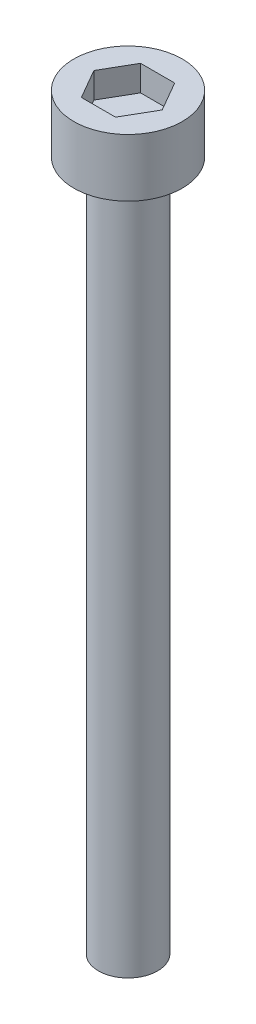
ISO-10303-21;
HEADER;
FILE_DESCRIPTION(('STEP AP214'),'2;1');
FILE_NAME('part.step','',(''),(''),'','','');
FILE_SCHEMA(('AUTOMOTIVE_DESIGN { 1 0 10303 214 1 1 1 1 }'));
ENDSEC;
DATA;
#1=APPLICATION_CONTEXT('core data for automotive mechanical design processes');
#2=APPLICATION_PROTOCOL_DEFINITION('international standard','automotive_design',2000,#1);
#3=PRODUCT_CONTEXT('',#1,'mechanical');
#4=PRODUCT('Part','Part','',(#3));
#5=PRODUCT_RELATED_PRODUCT_CATEGORY('part','',(#4));
#6=PRODUCT_DEFINITION_FORMATION('','',#4);
#7=PRODUCT_DEFINITION_CONTEXT('part definition',#1,'design');
#8=PRODUCT_DEFINITION('design','',#6,#7);
#9=PRODUCT_DEFINITION_SHAPE('','',#8);
#10=(LENGTH_UNIT() NAMED_UNIT(*) SI_UNIT(.MILLI.,.METRE.));
#11=(NAMED_UNIT(*) PLANE_ANGLE_UNIT() SI_UNIT($,.RADIAN.));
#12=(NAMED_UNIT(*) SI_UNIT($,.STERADIAN.) SOLID_ANGLE_UNIT());
#13=UNCERTAINTY_MEASURE_WITH_UNIT(LENGTH_MEASURE(1.E-05),#10,'distance_accuracy_value','');
#14=(GEOMETRIC_REPRESENTATION_CONTEXT(3) GLOBAL_UNCERTAINTY_ASSIGNED_CONTEXT((#13)) GLOBAL_UNIT_ASSIGNED_CONTEXT((#10,
#11,#12)) REPRESENTATION_CONTEXT('',''));
#15=CARTESIAN_POINT('',(0.,0.,0.));
#16=DIRECTION('',(0.,0.,1.));
#17=DIRECTION('',(1.,0.,0.));
#18=AXIS2_PLACEMENT_3D('',#15,#16,#17);
#19=CARTESIAN_POINT('',(0.,2.93,0.));
#20=DIRECTION('',(0.,1.,0.));
#21=DIRECTION('',(0.,0.,1.));
#22=AXIS2_PLACEMENT_3D('',#19,#20,#21);
#23=PLANE('',#22);
#24=CARTESIAN_POINT('',(0.,2.93,0.));
#25=DIRECTION('',(0.,1.,0.));
#26=DIRECTION('',(0.,0.,1.));
#27=AXIS2_PLACEMENT_3D('',#24,#25,#26);
#28=CIRCLE('',#27,2.75);
#29=CARTESIAN_POINT('',(0.,2.93,-2.75));
#30=VERTEX_POINT('',#29);
#31=EDGE_CURVE('E51',#30,#30,#28,.T.);
#32=ORIENTED_EDGE('',*,*,#31,.T.);
#33=EDGE_LOOP('',(#32));
#34=FACE_BOUND('',#33,.T.);
#35=DIRECTION('',(-1.,0.,0.));
#36=VECTOR('',#35,1.);
#37=CARTESIAN_POINT('',(0.866025403784439,2.93,-1.5));
#38=LINE('',#37,#36);
#39=CARTESIAN_POINT('',(0.866025403784439,2.93,-1.5));
#40=VERTEX_POINT('',#39);
#41=CARTESIAN_POINT('',(-0.866025403784439,2.93,-1.5));
#42=VERTEX_POINT('',#41);
#43=EDGE_CURVE('E125',#40,#42,#38,.T.);
#44=ORIENTED_EDGE('',*,*,#43,.F.);
#45=DIRECTION('',(-0.5,0.,-0.866025403784438));
#46=VECTOR('',#45,1.);
#47=CARTESIAN_POINT('',(1.73205080756888,2.93,0.));
#48=LINE('',#47,#46);
#49=CARTESIAN_POINT('',(1.73205080756888,2.93,0.));
#50=VERTEX_POINT('',#49);
#51=EDGE_CURVE('E124',#50,#40,#48,.T.);
#52=ORIENTED_EDGE('',*,*,#51,.F.);
#53=DIRECTION('',(0.5,0.,-0.866025403784438));
#54=VECTOR('',#53,1.);
#55=CARTESIAN_POINT('',(0.866025403784438,2.93,1.5));
#56=LINE('',#55,#54);
#57=CARTESIAN_POINT('',(0.866025403784439,2.93,1.5));
#58=VERTEX_POINT('',#57);
#59=EDGE_CURVE('E104',#58,#50,#56,.T.);
#60=ORIENTED_EDGE('',*,*,#59,.F.);
#61=DIRECTION('',(1.,0.,0.));
#62=VECTOR('',#61,1.);
#63=CARTESIAN_POINT('',(-0.866025403784438,2.93,1.5));
#64=LINE('',#63,#62);
#65=CARTESIAN_POINT('',(-0.866025403784438,2.93,1.5));
#66=VERTEX_POINT('',#65);
#67=EDGE_CURVE('E136',#66,#58,#64,.T.);
#68=ORIENTED_EDGE('',*,*,#67,.F.);
#69=DIRECTION('',(0.5,0.,0.866025403784438));
#70=VECTOR('',#69,1.);
#71=CARTESIAN_POINT('',(-1.73205080756888,2.93,0.));
#72=LINE('',#71,#70);
#73=CARTESIAN_POINT('',(-1.73205080756888,2.93,0.));
#74=VERTEX_POINT('',#73);
#75=EDGE_CURVE('E134',#74,#66,#72,.T.);
#76=ORIENTED_EDGE('',*,*,#75,.F.);
#77=DIRECTION('',(-0.5,0.,0.866025403784439));
#78=VECTOR('',#77,1.);
#79=CARTESIAN_POINT('',(-0.866025403784439,2.93,-1.5));
#80=LINE('',#79,#78);
#81=EDGE_CURVE('E131',#42,#74,#80,.T.);
#82=ORIENTED_EDGE('',*,*,#81,.F.);
#83=EDGE_LOOP('',(#44,#52,#60,#68,#76,#82));
#84=FACE_BOUND('',#83,.T.);
#85=ADVANCED_FACE('F43',(#34,#84),#23,.T.);
#86=CARTESIAN_POINT('',(0.,0.,0.));
#87=DIRECTION('',(0.,1.,0.));
#88=DIRECTION('',(0.,0.,1.));
#89=AXIS2_PLACEMENT_3D('',#86,#87,#88);
#90=PLANE('',#89);
#91=CARTESIAN_POINT('',(0.,0.,0.));
#92=DIRECTION('',(0.,1.,0.));
#93=DIRECTION('',(0.,0.,1.));
#94=AXIS2_PLACEMENT_3D('',#91,#92,#93);
#95=CIRCLE('',#94,1.5);
#96=CARTESIAN_POINT('',(0.,0.,1.5));
#97=VERTEX_POINT('',#96);
#98=EDGE_CURVE('E12',#97,#97,#95,.F.);
#99=ORIENTED_EDGE('',*,*,#98,.F.);
#100=EDGE_LOOP('',(#99));
#101=FACE_BOUND('',#100,.T.);
#102=CARTESIAN_POINT('',(0.,0.,0.));
#103=DIRECTION('',(0.,1.,0.));
#104=DIRECTION('',(0.,0.,1.));
#105=AXIS2_PLACEMENT_3D('',#102,#103,#104);
#106=CIRCLE('',#105,2.75);
#107=CARTESIAN_POINT('',(0.,0.,-2.75));
#108=VERTEX_POINT('',#107);
#109=EDGE_CURVE('E147',#108,#108,#106,.T.);
#110=ORIENTED_EDGE('',*,*,#109,.F.);
#111=EDGE_LOOP('',(#110));
#112=FACE_BOUND('',#111,.T.);
#113=ADVANCED_FACE('F156',(#101,#112),#90,.F.);
#114=CARTESIAN_POINT('',(0.,2.93,0.));
#115=DIRECTION('',(0.,-1.,0.));
#116=DIRECTION('',(0.,0.,-1.));
#117=AXIS2_PLACEMENT_3D('',#114,#115,#116);
#118=CYLINDRICAL_SURFACE('',#117,2.75);
#119=CARTESIAN_POINT('',(0.,2.93,-2.75));
#120=CARTESIAN_POINT('',(0.,2.89947916666667,-2.75));
#121=CARTESIAN_POINT('',(0.,2.86895833333333,-2.75));
#122=CARTESIAN_POINT('',(0.,2.80791666666667,-2.75));
#123=CARTESIAN_POINT('',(0.,2.77739583333333,-2.75));
#124=CARTESIAN_POINT('',(0.,2.71635416666667,-2.75));
#125=CARTESIAN_POINT('',(0.,2.68583333333333,-2.75));
#126=CARTESIAN_POINT('',(0.,2.62479166666667,-2.75));
#127=CARTESIAN_POINT('',(0.,2.59427083333333,-2.75));
#128=CARTESIAN_POINT('',(0.,2.53322916666667,-2.75));
#129=CARTESIAN_POINT('',(0.,2.50270833333333,-2.75));
#130=CARTESIAN_POINT('',(0.,2.44166666666667,-2.75));
#131=CARTESIAN_POINT('',(0.,2.41114583333333,-2.75));
#132=CARTESIAN_POINT('',(0.,2.35010416666667,-2.75));
#133=CARTESIAN_POINT('',(0.,2.31958333333333,-2.75));
#134=CARTESIAN_POINT('',(0.,2.25854166666667,-2.75));
#135=CARTESIAN_POINT('',(0.,2.22802083333333,-2.75));
#136=CARTESIAN_POINT('',(0.,2.16697916666667,-2.75));
#137=CARTESIAN_POINT('',(0.,2.13645833333333,-2.75));
#138=CARTESIAN_POINT('',(0.,2.07541666666667,-2.75));
#139=CARTESIAN_POINT('',(0.,2.04489583333333,-2.75));
#140=CARTESIAN_POINT('',(0.,1.98385416666667,-2.75));
#141=CARTESIAN_POINT('',(0.,1.95333333333333,-2.75));
#142=CARTESIAN_POINT('',(0.,1.89229166666667,-2.75));
#143=CARTESIAN_POINT('',(0.,1.86177083333333,-2.75));
#144=CARTESIAN_POINT('',(0.,1.80072916666667,-2.75));
#145=CARTESIAN_POINT('',(0.,1.77020833333333,-2.75));
#146=CARTESIAN_POINT('',(0.,1.70916666666667,-2.75));
#147=CARTESIAN_POINT('',(0.,1.67864583333333,-2.75));
#148=CARTESIAN_POINT('',(0.,1.61760416666667,-2.75));
#149=CARTESIAN_POINT('',(0.,1.58708333333333,-2.75));
#150=CARTESIAN_POINT('',(0.,1.52604166666667,-2.75));
#151=CARTESIAN_POINT('',(0.,1.49552083333333,-2.75));
#152=CARTESIAN_POINT('',(0.,1.43447916666667,-2.75));
#153=CARTESIAN_POINT('',(0.,1.40395833333333,-2.75));
#154=CARTESIAN_POINT('',(0.,1.34291666666667,-2.75));
#155=CARTESIAN_POINT('',(0.,1.31239583333333,-2.75));
#156=CARTESIAN_POINT('',(0.,1.25135416666667,-2.75));
#157=CARTESIAN_POINT('',(0.,1.22083333333333,-2.75));
#158=CARTESIAN_POINT('',(0.,1.15979166666667,-2.75));
#159=CARTESIAN_POINT('',(0.,1.12927083333333,-2.75));
#160=CARTESIAN_POINT('',(0.,1.06822916666667,-2.75));
#161=CARTESIAN_POINT('',(0.,1.03770833333333,-2.75));
#162=CARTESIAN_POINT('',(0.,0.976666666666666,-2.75));
#163=CARTESIAN_POINT('',(0.,0.946145833333333,-2.75));
#164=CARTESIAN_POINT('',(0.,0.885104166666666,-2.75));
#165=CARTESIAN_POINT('',(0.,0.854583333333333,-2.75));
#166=CARTESIAN_POINT('',(0.,0.793541666666666,-2.75));
#167=CARTESIAN_POINT('',(0.,0.763020833333333,-2.75));
#168=CARTESIAN_POINT('',(0.,0.701979166666667,-2.75));
#169=CARTESIAN_POINT('',(0.,0.671458333333333,-2.75));
#170=CARTESIAN_POINT('',(0.,0.610416666666667,-2.75));
#171=CARTESIAN_POINT('',(0.,0.579895833333333,-2.75));
#172=CARTESIAN_POINT('',(0.,0.518854166666667,-2.75));
#173=CARTESIAN_POINT('',(0.,0.488333333333333,-2.75));
#174=CARTESIAN_POINT('',(0.,0.427291666666667,-2.75));
#175=CARTESIAN_POINT('',(0.,0.396770833333333,-2.75));
#176=CARTESIAN_POINT('',(0.,0.335729166666666,-2.75));
#177=CARTESIAN_POINT('',(0.,0.305208333333333,-2.75));
#178=CARTESIAN_POINT('',(0.,0.244166666666666,-2.75));
#179=CARTESIAN_POINT('',(0.,0.213645833333333,-2.75));
#180=CARTESIAN_POINT('',(0.,0.152604166666666,-2.75));
#181=CARTESIAN_POINT('',(0.,0.122083333333333,-2.75));
#182=CARTESIAN_POINT('',(0.,0.0610416666666663,-2.75));
#183=CARTESIAN_POINT('',(0.,0.0305208333333329,-2.75));
#184=CARTESIAN_POINT('',(0.,0.,-2.75));
#185=B_SPLINE_CURVE_WITH_KNOTS('',3,(#119,#120,#121,#122,#123,#124,#125,#126,#127,#128,#129,
#130,#131,#132,#133,#134,#135,#136,#137,#138,#139,#140,#141,#142,#143,#144,#145,#146,#147,#148,
#149,#150,#151,#152,#153,#154,#155,#156,#157,#158,#159,#160,#161,#162,#163,#164,#165,#166,#167,
#168,#169,#170,#171,#172,#173,#174,#175,#176,#177,#178,#179,#180,#181,#182,#183,#184),
.UNSPECIFIED.,.F.,.F.,(4,2,2,2,2,2,2,2,2,2,2,2,2,2,2,2,2,2,2,2,2,2,2,2,2,2,2,2,2,2,2,2,4),(0.,
0.0915625000000001,0.183125,0.2746875,0.36625,0.4578125,0.549375,0.6409375,0.7325,
0.824062500000001,0.915625000000001,1.0071875,1.09875,1.1903125,1.281875,1.3734375,1.465,
1.5565625,1.648125,1.7396875,1.83125,1.9228125,2.014375,2.1059375,2.1975,2.2890625,2.380625,
2.4721875,2.56375,2.6553125,2.746875,2.8384375,2.93),.UNSPECIFIED.);
#186=EDGE_CURVE('BSEAM44',#30,#108,#185,.T.);
#187=ORIENTED_EDGE('',*,*,#31,.F.);
#188=ORIENTED_EDGE('',*,*,#109,.T.);
#189=ORIENTED_EDGE('',*,*,#186,.T.);
#190=ORIENTED_EDGE('',*,*,#186,.F.);
#191=EDGE_LOOP('',(#187,#189,#188,#190));
#192=FACE_BOUND('',#191,.T.);
#193=ADVANCED_FACE('F44',(#192),#118,.T.);
#194=CARTESIAN_POINT('',(1.73205080756888,2.93,0.));
#195=DIRECTION('',(-0.866025403784438,0.,0.5));
#196=DIRECTION('',(0.5,0.,0.866025403784439));
#197=AXIS2_PLACEMENT_3D('',#194,#195,#196);
#198=PLANE('',#197);
#199=DIRECTION('',(-0.5,0.,-0.866025403784439));
#200=VECTOR('',#199,1.);
#201=CARTESIAN_POINT('',(1.73205080756888,1.63,0.));
#202=LINE('',#201,#200);
#203=CARTESIAN_POINT('',(1.73205080756888,1.63,0.));
#204=VERTEX_POINT('',#203);
#205=CARTESIAN_POINT('',(0.866025403784439,1.63,-1.5));
#206=VERTEX_POINT('',#205);
#207=EDGE_CURVE('E112',#204,#206,#202,.T.);
#208=ORIENTED_EDGE('',*,*,#207,.F.);
#209=DIRECTION('',(0.,-1.,0.));
#210=VECTOR('',#209,1.);
#211=CARTESIAN_POINT('',(1.73205080756888,2.93,0.));
#212=LINE('',#211,#210);
#213=EDGE_CURVE('E98',#50,#204,#212,.T.);
#214=ORIENTED_EDGE('',*,*,#213,.F.);
#215=ORIENTED_EDGE('',*,*,#51,.T.);
#216=DIRECTION('',(0.,-1.,0.));
#217=VECTOR('',#216,1.);
#218=CARTESIAN_POINT('',(0.866025403784439,2.93,-1.5));
#219=LINE('',#218,#217);
#220=EDGE_CURVE('E114',#40,#206,#219,.T.);
#221=ORIENTED_EDGE('',*,*,#220,.T.);
#222=EDGE_LOOP('',(#208,#214,#215,#221));
#223=FACE_BOUND('',#222,.T.);
#224=ADVANCED_FACE('F115',(#223),#198,.T.);
#225=CARTESIAN_POINT('',(0.866025403784439,2.93,-1.5));
#226=DIRECTION('',(0.,0.,1.));
#227=DIRECTION('',(1.,0.,0.));
#228=AXIS2_PLACEMENT_3D('',#225,#226,#227);
#229=PLANE('',#228);
#230=DIRECTION('',(-1.,0.,0.));
#231=VECTOR('',#230,1.);
#232=CARTESIAN_POINT('',(0.866025403784439,1.63,-1.5));
#233=LINE('',#232,#231);
#234=CARTESIAN_POINT('',(-0.866025403784439,1.63,-1.5));
#235=VERTEX_POINT('',#234);
#236=EDGE_CURVE('E59',#206,#235,#233,.T.);
#237=ORIENTED_EDGE('',*,*,#236,.F.);
#238=ORIENTED_EDGE('',*,*,#220,.F.);
#239=ORIENTED_EDGE('',*,*,#43,.T.);
#240=DIRECTION('',(0.,-1.,0.));
#241=VECTOR('',#240,1.);
#242=CARTESIAN_POINT('',(-0.866025403784439,2.93,-1.5));
#243=LINE('',#242,#241);
#244=EDGE_CURVE('E150',#42,#235,#243,.T.);
#245=ORIENTED_EDGE('',*,*,#244,.T.);
#246=EDGE_LOOP('',(#237,#238,#239,#245));
#247=FACE_BOUND('',#246,.T.);
#248=ADVANCED_FACE('F175',(#247),#229,.T.);
#249=CARTESIAN_POINT('',(-0.866025403784439,2.93,-1.5));
#250=DIRECTION('',(0.866025403784438,0.,0.5));
#251=DIRECTION('',(0.5,0.,-0.866025403784439));
#252=AXIS2_PLACEMENT_3D('',#249,#250,#251);
#253=PLANE('',#252);
#254=DIRECTION('',(-0.5,0.,0.866025403784439));
#255=VECTOR('',#254,1.);
#256=CARTESIAN_POINT('',(-0.866025403784439,1.63,-1.5));
#257=LINE('',#256,#255);
#258=CARTESIAN_POINT('',(-1.73205080756888,1.63,0.));
#259=VERTEX_POINT('',#258);
#260=EDGE_CURVE('E69',#235,#259,#257,.T.);
#261=ORIENTED_EDGE('',*,*,#260,.F.);
#262=ORIENTED_EDGE('',*,*,#244,.F.);
#263=ORIENTED_EDGE('',*,*,#81,.T.);
#264=DIRECTION('',(0.,-1.,0.));
#265=VECTOR('',#264,1.);
#266=CARTESIAN_POINT('',(-1.73205080756888,2.93,0.));
#267=LINE('',#266,#265);
#268=EDGE_CURVE('E144',#74,#259,#267,.T.);
#269=ORIENTED_EDGE('',*,*,#268,.T.);
#270=EDGE_LOOP('',(#261,#262,#263,#269));
#271=FACE_BOUND('',#270,.T.);
#272=ADVANCED_FACE('F174',(#271),#253,.T.);
#273=CARTESIAN_POINT('',(-1.73205080756888,2.93,0.));
#274=DIRECTION('',(0.866025403784439,0.,-0.5));
#275=DIRECTION('',(-0.5,0.,-0.866025403784439));
#276=AXIS2_PLACEMENT_3D('',#273,#274,#275);
#277=PLANE('',#276);
#278=DIRECTION('',(0.5,0.,0.866025403784439));
#279=VECTOR('',#278,1.);
#280=CARTESIAN_POINT('',(-1.73205080756888,1.63,0.));
#281=LINE('',#280,#279);
#282=CARTESIAN_POINT('',(-0.866025403784438,1.63,1.5));
#283=VERTEX_POINT('',#282);
#284=EDGE_CURVE('E122',#259,#283,#281,.T.);
#285=ORIENTED_EDGE('',*,*,#284,.F.);
#286=ORIENTED_EDGE('',*,*,#268,.F.);
#287=ORIENTED_EDGE('',*,*,#75,.T.);
#288=DIRECTION('',(0.,-1.,0.));
#289=VECTOR('',#288,1.);
#290=CARTESIAN_POINT('',(-0.866025403784438,2.93,1.5));
#291=LINE('',#290,#289);
#292=EDGE_CURVE('E142',#66,#283,#291,.T.);
#293=ORIENTED_EDGE('',*,*,#292,.T.);
#294=EDGE_LOOP('',(#285,#286,#287,#293));
#295=FACE_BOUND('',#294,.T.);
#296=ADVANCED_FACE('F180',(#295),#277,.T.);
#297=CARTESIAN_POINT('',(-0.866025403784438,2.93,1.5));
#298=DIRECTION('',(0.,0.,-1.));
#299=DIRECTION('',(-1.,0.,0.));
#300=AXIS2_PLACEMENT_3D('',#297,#298,#299);
#301=PLANE('',#300);
#302=DIRECTION('',(1.,0.,0.));
#303=VECTOR('',#302,1.);
#304=CARTESIAN_POINT('',(-0.866025403784438,1.63,1.5));
#305=LINE('',#304,#303);
#306=CARTESIAN_POINT('',(0.866025403784438,1.63,1.5));
#307=VERTEX_POINT('',#306);
#308=EDGE_CURVE('E119',#283,#307,#305,.T.);
#309=ORIENTED_EDGE('',*,*,#308,.F.);
#310=ORIENTED_EDGE('',*,*,#292,.F.);
#311=ORIENTED_EDGE('',*,*,#67,.T.);
#312=DIRECTION('',(0.,-1.,0.));
#313=VECTOR('',#312,1.);
#314=CARTESIAN_POINT('',(0.866025403784438,2.93,1.5));
#315=LINE('',#314,#313);
#316=EDGE_CURVE('E107',#58,#307,#315,.T.);
#317=ORIENTED_EDGE('',*,*,#316,.T.);
#318=EDGE_LOOP('',(#309,#310,#311,#317));
#319=FACE_BOUND('',#318,.T.);
#320=ADVANCED_FACE('F182',(#319),#301,.T.);
#321=CARTESIAN_POINT('',(0.866025403784438,2.93,1.5));
#322=DIRECTION('',(-0.866025403784438,0.,-0.5));
#323=DIRECTION('',(-0.5,0.,0.866025403784439));
#324=AXIS2_PLACEMENT_3D('',#321,#322,#323);
#325=PLANE('',#324);
#326=DIRECTION('',(0.5,0.,-0.866025403784439));
#327=VECTOR('',#326,1.);
#328=CARTESIAN_POINT('',(0.866025403784438,1.63,1.5));
#329=LINE('',#328,#327);
#330=EDGE_CURVE('E105',#307,#204,#329,.T.);
#331=ORIENTED_EDGE('',*,*,#330,.F.);
#332=ORIENTED_EDGE('',*,*,#316,.F.);
#333=ORIENTED_EDGE('',*,*,#59,.T.);
#334=ORIENTED_EDGE('',*,*,#213,.T.);
#335=EDGE_LOOP('',(#331,#332,#333,#334));
#336=FACE_BOUND('',#335,.T.);
#337=ADVANCED_FACE('F99',(#336),#325,.T.);
#338=CARTESIAN_POINT('',(0.,1.63,0.));
#339=DIRECTION('',(0.,1.,0.));
#340=DIRECTION('',(0.,0.,1.));
#341=AXIS2_PLACEMENT_3D('',#338,#339,#340);
#342=PLANE('',#341);
#343=ORIENTED_EDGE('',*,*,#207,.T.);
#344=ORIENTED_EDGE('',*,*,#236,.T.);
#345=ORIENTED_EDGE('',*,*,#260,.T.);
#346=ORIENTED_EDGE('',*,*,#284,.T.);
#347=ORIENTED_EDGE('',*,*,#308,.T.);
#348=ORIENTED_EDGE('',*,*,#330,.T.);
#349=EDGE_LOOP('',(#343,#344,#345,#346,#347,#348));
#350=FACE_BOUND('',#349,.T.);
#351=ADVANCED_FACE('F116',(#350),#342,.T.);
#352=CARTESIAN_POINT('',(0.,-35.,0.));
#353=DIRECTION('',(0.,1.,0.));
#354=DIRECTION('',(0.,0.,1.));
#355=AXIS2_PLACEMENT_3D('',#352,#353,#354);
#356=CYLINDRICAL_SURFACE('',#355,1.5);
#357=CARTESIAN_POINT('',(0.,-35.,0.));
#358=DIRECTION('',(0.,-1.,0.));
#359=DIRECTION('',(0.,0.,-1.));
#360=AXIS2_PLACEMENT_3D('',#357,#358,#359);
#361=CIRCLE('',#360,1.5);
#362=CARTESIAN_POINT('',(0.,-35.,-1.5));
#363=VERTEX_POINT('',#362);
#364=EDGE_CURVE('E113',#363,#363,#361,.T.);
#365=ORIENTED_EDGE('',*,*,#364,.F.);
#366=EDGE_LOOP('',(#365));
#367=FACE_BOUND('',#366,.T.);
#368=ORIENTED_EDGE('',*,*,#98,.T.);
#369=EDGE_LOOP('',(#368));
#370=FACE_BOUND('',#369,.T.);
#371=ADVANCED_FACE('F187',(#367,#370),#356,.T.);
#372=CARTESIAN_POINT('',(0.,-35.,0.));
#373=DIRECTION('',(0.,-1.,0.));
#374=DIRECTION('',(0.,0.,-1.));
#375=AXIS2_PLACEMENT_3D('',#372,#373,#374);
#376=PLANE('',#375);
#377=ORIENTED_EDGE('',*,*,#364,.T.);
#378=EDGE_LOOP('',(#377));
#379=FACE_BOUND('',#378,.T.);
#380=ADVANCED_FACE('F191',(#379),#376,.T.);
#381=CLOSED_SHELL('',(#85,#113,#193,#224,#248,#272,#296,#320,#337,#351,#371,#380));
#382=MANIFOLD_SOLID_BREP('B2',#381);
#383=ADVANCED_BREP_SHAPE_REPRESENTATION('',(#18,#382),#14);
#384=SHAPE_DEFINITION_REPRESENTATION(#9,#383);
ENDSEC;
END-ISO-10303-21;
